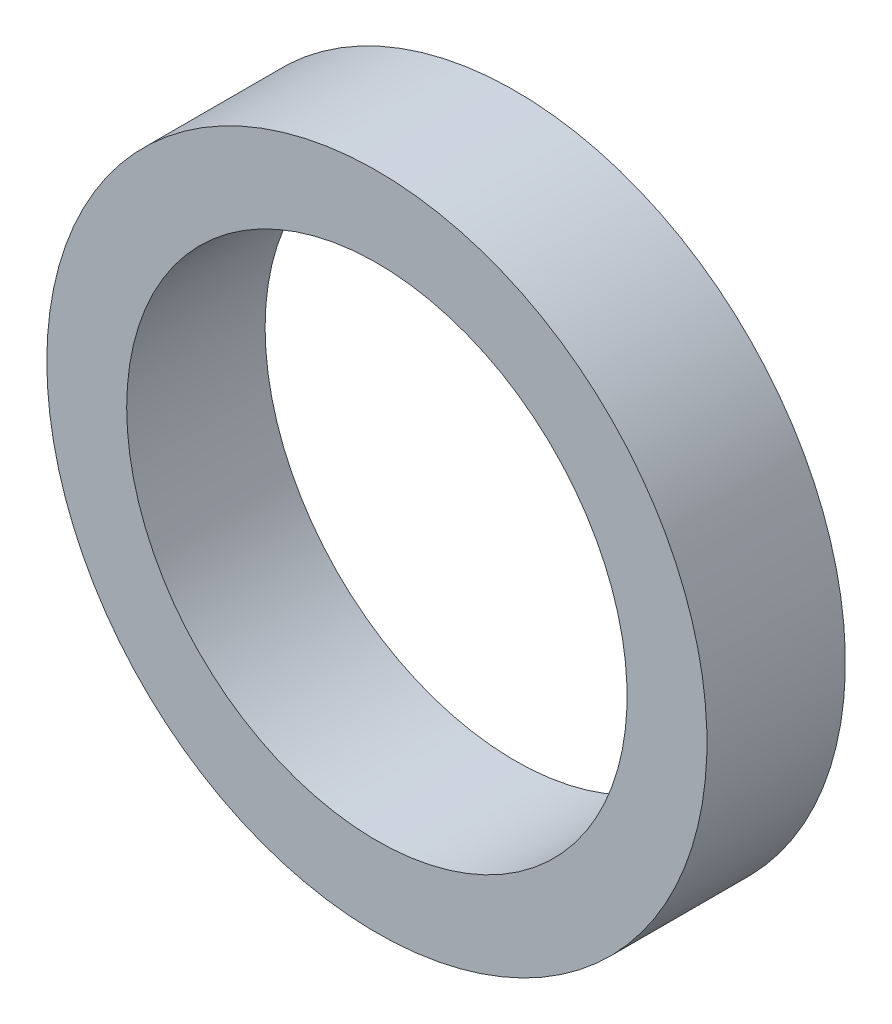
ISO-10303-21;
HEADER;
FILE_DESCRIPTION(('STEP AP214'),'2;1');
FILE_NAME('part.step','',(''),(''),'','','');
FILE_SCHEMA(('AUTOMOTIVE_DESIGN { 1 0 10303 214 1 1 1 1 }'));
ENDSEC;
DATA;
#1=APPLICATION_CONTEXT('core data for automotive mechanical design processes');
#2=APPLICATION_PROTOCOL_DEFINITION('international standard','automotive_design',2000,#1);
#3=PRODUCT_CONTEXT('',#1,'mechanical');
#4=PRODUCT('Part','Part','',(#3));
#5=PRODUCT_RELATED_PRODUCT_CATEGORY('part','',(#4));
#6=PRODUCT_DEFINITION_FORMATION('','',#4);
#7=PRODUCT_DEFINITION_CONTEXT('part definition',#1,'design');
#8=PRODUCT_DEFINITION('design','',#6,#7);
#9=PRODUCT_DEFINITION_SHAPE('','',#8);
#10=(LENGTH_UNIT() NAMED_UNIT(*) SI_UNIT(.MILLI.,.METRE.));
#11=(NAMED_UNIT(*) PLANE_ANGLE_UNIT() SI_UNIT($,.RADIAN.));
#12=(NAMED_UNIT(*) SI_UNIT($,.STERADIAN.) SOLID_ANGLE_UNIT());
#13=UNCERTAINTY_MEASURE_WITH_UNIT(LENGTH_MEASURE(1.E-05),#10,'distance_accuracy_value','');
#14=(GEOMETRIC_REPRESENTATION_CONTEXT(3) GLOBAL_UNCERTAINTY_ASSIGNED_CONTEXT((#13)) GLOBAL_UNIT_ASSIGNED_CONTEXT((#10,
#11,#12)) REPRESENTATION_CONTEXT('',''));
#15=CARTESIAN_POINT('',(0.,0.,0.));
#16=DIRECTION('',(0.,0.,1.));
#17=DIRECTION('',(1.,0.,0.));
#18=AXIS2_PLACEMENT_3D('',#15,#16,#17);
#19=CARTESIAN_POINT('',(31.,0.,13.));
#20=DIRECTION('',(0.,0.,1.));
#21=DIRECTION('',(1.,0.,0.));
#22=AXIS2_PLACEMENT_3D('',#19,#20,#21);
#23=PLANE('',#22);
#24=CARTESIAN_POINT('',(0.,0.,13.));
#25=DIRECTION('',(0.,0.,-1.));
#26=DIRECTION('',(-1.,0.,0.));
#27=AXIS2_PLACEMENT_3D('',#24,#25,#26);
#28=CIRCLE('',#27,31.);
#29=CARTESIAN_POINT('',(-31.,0.,13.));
#30=VERTEX_POINT('',#29);
#31=EDGE_CURVE('E17',#30,#30,#28,.T.);
#32=ORIENTED_EDGE('',*,*,#31,.F.);
#33=EDGE_LOOP('',(#32));
#34=FACE_BOUND('',#33,.T.);
#35=CARTESIAN_POINT('',(0.,0.,13.));
#36=DIRECTION('',(0.,0.,-1.));
#37=DIRECTION('',(-1.,0.,0.));
#38=AXIS2_PLACEMENT_3D('',#35,#36,#37);
#39=CIRCLE('',#38,23.5);
#40=CARTESIAN_POINT('',(-23.5,0.,13.));
#41=VERTEX_POINT('',#40);
#42=EDGE_CURVE('E26',#41,#41,#39,.T.);
#43=ORIENTED_EDGE('',*,*,#42,.T.);
#44=EDGE_LOOP('',(#43));
#45=FACE_BOUND('',#44,.T.);
#46=ADVANCED_FACE('F14',(#34,#45),#23,.T.);
#47=CARTESIAN_POINT('',(0.,0.,13.));
#48=DIRECTION('',(0.,0.,-1.));
#49=DIRECTION('',(-1.,0.,0.));
#50=AXIS2_PLACEMENT_3D('',#47,#48,#49);
#51=CYLINDRICAL_SURFACE('',#50,31.);
#52=ORIENTED_EDGE('',*,*,#31,.T.);
#53=EDGE_LOOP('',(#52));
#54=FACE_BOUND('',#53,.T.);
#55=CARTESIAN_POINT('',(0.,0.,0.));
#56=DIRECTION('',(0.,0.,-1.));
#57=DIRECTION('',(-1.,0.,0.));
#58=AXIS2_PLACEMENT_3D('',#55,#56,#57);
#59=CIRCLE('',#58,31.);
#60=CARTESIAN_POINT('',(-31.,0.,0.));
#61=VERTEX_POINT('',#60);
#62=EDGE_CURVE('E21',#61,#61,#59,.T.);
#63=ORIENTED_EDGE('',*,*,#62,.F.);
#64=EDGE_LOOP('',(#63));
#65=FACE_BOUND('',#64,.T.);
#66=ADVANCED_FACE('F34',(#54,#65),#51,.T.);
#67=CARTESIAN_POINT('',(0.,0.,13.));
#68=DIRECTION('',(0.,0.,-1.));
#69=DIRECTION('',(-1.,0.,0.));
#70=AXIS2_PLACEMENT_3D('',#67,#68,#69);
#71=CYLINDRICAL_SURFACE('',#70,23.5);
#72=CARTESIAN_POINT('',(0.,0.,0.));
#73=DIRECTION('',(0.,0.,-1.));
#74=DIRECTION('',(-1.,0.,0.));
#75=AXIS2_PLACEMENT_3D('',#72,#73,#74);
#76=CIRCLE('',#75,23.5);
#77=CARTESIAN_POINT('',(-23.5,0.,0.));
#78=VERTEX_POINT('',#77);
#79=EDGE_CURVE('E10',#78,#78,#76,.F.);
#80=ORIENTED_EDGE('',*,*,#79,.F.);
#81=EDGE_LOOP('',(#80));
#82=FACE_BOUND('',#81,.T.);
#83=ORIENTED_EDGE('',*,*,#42,.F.);
#84=EDGE_LOOP('',(#83));
#85=FACE_BOUND('',#84,.T.);
#86=ADVANCED_FACE('F42',(#82,#85),#71,.F.);
#87=CARTESIAN_POINT('',(23.5,0.,0.));
#88=DIRECTION('',(0.,0.,-1.));
#89=DIRECTION('',(-1.,0.,0.));
#90=AXIS2_PLACEMENT_3D('',#87,#88,#89);
#91=PLANE('',#90);
#92=ORIENTED_EDGE('',*,*,#79,.T.);
#93=EDGE_LOOP('',(#92));
#94=FACE_BOUND('',#93,.T.);
#95=ORIENTED_EDGE('',*,*,#62,.T.);
#96=EDGE_LOOP('',(#95));
#97=FACE_BOUND('',#96,.T.);
#98=ADVANCED_FACE('F43',(#94,#97),#91,.T.);
#99=CLOSED_SHELL('',(#46,#66,#86,#98));
#100=MANIFOLD_SOLID_BREP('B1',#99);
#101=ADVANCED_BREP_SHAPE_REPRESENTATION('',(#18,#100),#14);
#102=SHAPE_DEFINITION_REPRESENTATION(#9,#101);
ENDSEC;
END-ISO-10303-21;
